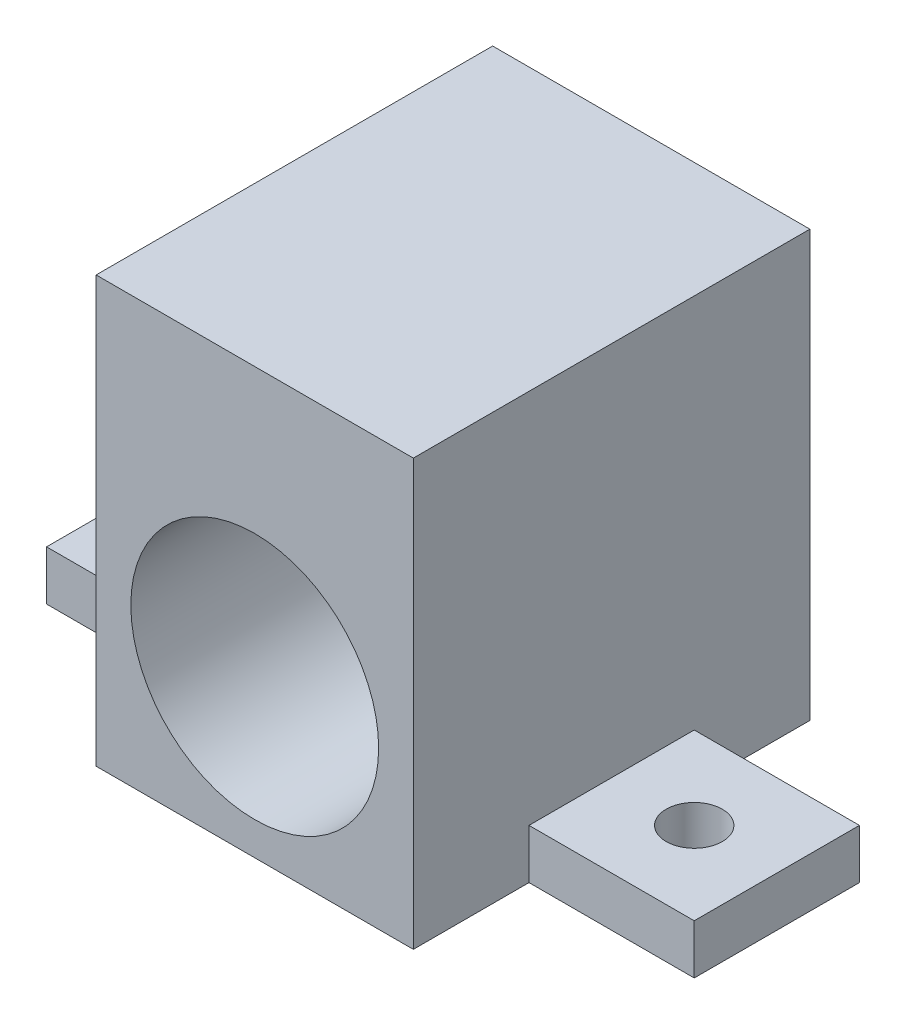
ISO-10303-21;
HEADER;
FILE_DESCRIPTION(('STEP AP214'),'2;1');
FILE_NAME('part.step','',(''),(''),'','','');
FILE_SCHEMA(('AUTOMOTIVE_DESIGN { 1 0 10303 214 1 1 1 1 }'));
ENDSEC;
DATA;
#1=APPLICATION_CONTEXT('core data for automotive mechanical design processes');
#2=APPLICATION_PROTOCOL_DEFINITION('international standard','automotive_design',2000,#1);
#3=PRODUCT_CONTEXT('',#1,'mechanical');
#4=PRODUCT('Part','Part','',(#3));
#5=PRODUCT_RELATED_PRODUCT_CATEGORY('part','',(#4));
#6=PRODUCT_DEFINITION_FORMATION('','',#4);
#7=PRODUCT_DEFINITION_CONTEXT('part definition',#1,'design');
#8=PRODUCT_DEFINITION('design','',#6,#7);
#9=PRODUCT_DEFINITION_SHAPE('','',#8);
#10=(LENGTH_UNIT() NAMED_UNIT(*) SI_UNIT(.MILLI.,.METRE.));
#11=(NAMED_UNIT(*) PLANE_ANGLE_UNIT() SI_UNIT($,.RADIAN.));
#12=(NAMED_UNIT(*) SI_UNIT($,.STERADIAN.) SOLID_ANGLE_UNIT());
#13=UNCERTAINTY_MEASURE_WITH_UNIT(LENGTH_MEASURE(1.E-05),#10,'distance_accuracy_value','');
#14=(GEOMETRIC_REPRESENTATION_CONTEXT(3) GLOBAL_UNCERTAINTY_ASSIGNED_CONTEXT((#13)) GLOBAL_UNIT_ASSIGNED_CONTEXT((#10,
#11,#12)) REPRESENTATION_CONTEXT('',''));
#15=CARTESIAN_POINT('',(0.,0.,0.));
#16=DIRECTION('',(0.,0.,1.));
#17=DIRECTION('',(1.,0.,0.));
#18=AXIS2_PLACEMENT_3D('',#15,#16,#17);
#19=CARTESIAN_POINT('',(0.,3.,0.));
#20=DIRECTION('',(0.,1.,0.));
#21=DIRECTION('',(0.,0.,1.));
#22=AXIS2_PLACEMENT_3D('',#19,#20,#21);
#23=PLANE('',#22);
#24=DIRECTION('',(0.,0.,-1.));
#25=VECTOR('',#24,1.);
#26=CARTESIAN_POINT('',(9.59999999999999,3.,-12.));
#27=LINE('',#26,#25);
#28=CARTESIAN_POINT('',(9.59999999999999,3.,5.));
#29=VERTEX_POINT('',#28);
#30=CARTESIAN_POINT('',(9.59999999999999,3.,-5.));
#31=VERTEX_POINT('',#30);
#32=EDGE_CURVE('E11',#29,#31,#27,.T.);
#33=ORIENTED_EDGE('',*,*,#32,.F.);
#34=DIRECTION('',(1.,0.,0.));
#35=VECTOR('',#34,1.);
#36=CARTESIAN_POINT('',(19.6,3.,5.));
#37=LINE('',#36,#35);
#38=CARTESIAN_POINT('',(19.6,3.,5.));
#39=VERTEX_POINT('',#38);
#40=EDGE_CURVE('E131',#29,#39,#37,.T.);
#41=ORIENTED_EDGE('',*,*,#40,.T.);
#42=DIRECTION('',(0.,0.,-1.));
#43=VECTOR('',#42,1.);
#44=CARTESIAN_POINT('',(19.6,3.,-5.));
#45=LINE('',#44,#43);
#46=CARTESIAN_POINT('',(19.6,3.,-5.));
#47=VERTEX_POINT('',#46);
#48=EDGE_CURVE('E124',#39,#47,#45,.T.);
#49=ORIENTED_EDGE('',*,*,#48,.T.);
#50=DIRECTION('',(-1.,0.,0.));
#51=VECTOR('',#50,1.);
#52=CARTESIAN_POINT('',(9.59999999999999,3.,-5.));
#53=LINE('',#52,#51);
#54=EDGE_CURVE('E128',#47,#31,#53,.T.);
#55=ORIENTED_EDGE('',*,*,#54,.T.);
#56=EDGE_LOOP('',(#33,#41,#49,#55));
#57=FACE_BOUND('',#56,.T.);
#58=CARTESIAN_POINT('',(14.6,3.,0.));
#59=DIRECTION('',(0.,1.,0.));
#60=DIRECTION('',(0.,0.,1.));
#61=AXIS2_PLACEMENT_3D('',#58,#59,#60);
#62=CIRCLE('',#61,1.7);
#63=CARTESIAN_POINT('',(14.6,3.,1.7));
#64=VERTEX_POINT('',#63);
#65=EDGE_CURVE('E254',#64,#64,#62,.T.);
#66=ORIENTED_EDGE('',*,*,#65,.F.);
#67=EDGE_LOOP('',(#66));
#68=FACE_BOUND('',#67,.T.);
#69=ADVANCED_FACE('F33',(#57,#68),#23,.T.);
#70=DIRECTION('',(0.,0.,1.));
#71=VECTOR('',#70,1.);
#72=CARTESIAN_POINT('',(-9.6,3.,-12.));
#73=LINE('',#72,#71);
#74=CARTESIAN_POINT('',(-9.60000000000001,3.,-5.));
#75=VERTEX_POINT('',#74);
#76=CARTESIAN_POINT('',(-9.60000000000001,3.,5.));
#77=VERTEX_POINT('',#76);
#78=EDGE_CURVE('E43',#75,#77,#73,.T.);
#79=ORIENTED_EDGE('',*,*,#78,.F.);
#80=DIRECTION('',(-1.,0.,0.));
#81=VECTOR('',#80,1.);
#82=CARTESIAN_POINT('',(-19.6,3.,-5.));
#83=LINE('',#82,#81);
#84=CARTESIAN_POINT('',(-19.6,3.,-5.));
#85=VERTEX_POINT('',#84);
#86=EDGE_CURVE('E170',#75,#85,#83,.T.);
#87=ORIENTED_EDGE('',*,*,#86,.T.);
#88=DIRECTION('',(0.,0.,1.));
#89=VECTOR('',#88,1.);
#90=CARTESIAN_POINT('',(-19.6,3.,5.));
#91=LINE('',#90,#89);
#92=CARTESIAN_POINT('',(-19.6,3.,5.));
#93=VERTEX_POINT('',#92);
#94=EDGE_CURVE('E109',#85,#93,#91,.T.);
#95=ORIENTED_EDGE('',*,*,#94,.T.);
#96=DIRECTION('',(1.,0.,0.));
#97=VECTOR('',#96,1.);
#98=CARTESIAN_POINT('',(-9.60000000000001,3.,5.));
#99=LINE('',#98,#97);
#100=EDGE_CURVE('E166',#93,#77,#99,.T.);
#101=ORIENTED_EDGE('',*,*,#100,.T.);
#102=EDGE_LOOP('',(#79,#87,#95,#101));
#103=FACE_BOUND('',#102,.T.);
#104=CARTESIAN_POINT('',(-14.6,3.,0.));
#105=DIRECTION('',(0.,1.,0.));
#106=DIRECTION('',(0.,0.,1.));
#107=AXIS2_PLACEMENT_3D('',#104,#105,#106);
#108=CIRCLE('',#107,1.7);
#109=CARTESIAN_POINT('',(-14.6,3.,1.7));
#110=VERTEX_POINT('',#109);
#111=EDGE_CURVE('E214',#110,#110,#108,.T.);
#112=ORIENTED_EDGE('',*,*,#111,.F.);
#113=EDGE_LOOP('',(#112));
#114=FACE_BOUND('',#113,.T.);
#115=ADVANCED_FACE('F247',(#103,#114),#23,.T.);
#116=CARTESIAN_POINT('',(0.,0.,0.));
#117=DIRECTION('',(0.,1.,0.));
#118=DIRECTION('',(0.,0.,1.));
#119=AXIS2_PLACEMENT_3D('',#116,#117,#118);
#120=PLANE('',#119);
#121=CARTESIAN_POINT('',(-14.6,0.,0.));
#122=DIRECTION('',(0.,1.,0.));
#123=DIRECTION('',(0.,0.,1.));
#124=AXIS2_PLACEMENT_3D('',#121,#122,#123);
#125=CIRCLE('',#124,1.7);
#126=CARTESIAN_POINT('',(-14.6,0.,1.7));
#127=VERTEX_POINT('',#126);
#128=EDGE_CURVE('E219',#127,#127,#125,.T.);
#129=ORIENTED_EDGE('',*,*,#128,.T.);
#130=EDGE_LOOP('',(#129));
#131=FACE_BOUND('',#130,.T.);
#132=DIRECTION('',(-1.,0.,0.));
#133=VECTOR('',#132,1.);
#134=CARTESIAN_POINT('',(-19.6,0.,-5.));
#135=LINE('',#134,#133);
#136=CARTESIAN_POINT('',(-9.60000000000001,0.,-5.));
#137=VERTEX_POINT('',#136);
#138=CARTESIAN_POINT('',(-19.6,0.,-5.));
#139=VERTEX_POINT('',#138);
#140=EDGE_CURVE('E211',#137,#139,#135,.T.);
#141=ORIENTED_EDGE('',*,*,#140,.F.);
#142=DIRECTION('',(0.,0.,1.));
#143=VECTOR('',#142,1.);
#144=CARTESIAN_POINT('',(-9.60000000000001,0.,-5.));
#145=LINE('',#144,#143);
#146=CARTESIAN_POINT('',(-9.60000000000001,0.,-12.));
#147=VERTEX_POINT('',#146);
#148=EDGE_CURVE('E100',#147,#137,#145,.T.);
#149=ORIENTED_EDGE('',*,*,#148,.F.);
#150=DIRECTION('',(-1.,0.,0.));
#151=VECTOR('',#150,1.);
#152=CARTESIAN_POINT('',(-9.60000000000001,0.,-12.));
#153=LINE('',#152,#151);
#154=CARTESIAN_POINT('',(9.59999999999999,0.,-12.));
#155=VERTEX_POINT('',#154);
#156=EDGE_CURVE('E94',#155,#147,#153,.T.);
#157=ORIENTED_EDGE('',*,*,#156,.F.);
#158=DIRECTION('',(0.,0.,-1.));
#159=VECTOR('',#158,1.);
#160=CARTESIAN_POINT('',(9.59999999999999,0.,-12.));
#161=LINE('',#160,#159);
#162=CARTESIAN_POINT('',(9.59999999999999,0.,-5.));
#163=VERTEX_POINT('',#162);
#164=EDGE_CURVE('E190',#163,#155,#161,.T.);
#165=ORIENTED_EDGE('',*,*,#164,.F.);
#166=DIRECTION('',(-1.,0.,0.));
#167=VECTOR('',#166,1.);
#168=CARTESIAN_POINT('',(9.59999999999999,0.,-5.));
#169=LINE('',#168,#167);
#170=CARTESIAN_POINT('',(19.6,0.,-5.));
#171=VERTEX_POINT('',#170);
#172=EDGE_CURVE('E232',#171,#163,#169,.T.);
#173=ORIENTED_EDGE('',*,*,#172,.F.);
#174=DIRECTION('',(0.,0.,-1.));
#175=VECTOR('',#174,1.);
#176=CARTESIAN_POINT('',(19.6,0.,-5.));
#177=LINE('',#176,#175);
#178=CARTESIAN_POINT('',(19.6,0.,5.));
#179=VERTEX_POINT('',#178);
#180=EDGE_CURVE('E140',#179,#171,#177,.T.);
#181=ORIENTED_EDGE('',*,*,#180,.F.);
#182=DIRECTION('',(1.,0.,0.));
#183=VECTOR('',#182,1.);
#184=CARTESIAN_POINT('',(19.6,0.,5.));
#185=LINE('',#184,#183);
#186=CARTESIAN_POINT('',(9.59999999999999,0.,5.));
#187=VERTEX_POINT('',#186);
#188=EDGE_CURVE('E229',#187,#179,#185,.T.);
#189=ORIENTED_EDGE('',*,*,#188,.F.);
#190=DIRECTION('',(0.,0.,-1.));
#191=VECTOR('',#190,1.);
#192=CARTESIAN_POINT('',(9.59999999999999,0.,5.));
#193=LINE('',#192,#191);
#194=CARTESIAN_POINT('',(9.59999999999999,0.,12.));
#195=VERTEX_POINT('',#194);
#196=EDGE_CURVE('E227',#195,#187,#193,.T.);
#197=ORIENTED_EDGE('',*,*,#196,.F.);
#198=DIRECTION('',(1.,0.,0.));
#199=VECTOR('',#198,1.);
#200=CARTESIAN_POINT('',(9.59999999999999,0.,12.));
#201=LINE('',#200,#199);
#202=CARTESIAN_POINT('',(-9.6,0.,12.));
#203=VERTEX_POINT('',#202);
#204=EDGE_CURVE('E225',#203,#195,#201,.T.);
#205=ORIENTED_EDGE('',*,*,#204,.F.);
#206=DIRECTION('',(0.,0.,1.));
#207=VECTOR('',#206,1.);
#208=CARTESIAN_POINT('',(-9.6,0.,12.));
#209=LINE('',#208,#207);
#210=CARTESIAN_POINT('',(-9.60000000000001,0.,5.));
#211=VERTEX_POINT('',#210);
#212=EDGE_CURVE('E223',#211,#203,#209,.T.);
#213=ORIENTED_EDGE('',*,*,#212,.F.);
#214=DIRECTION('',(1.,0.,0.));
#215=VECTOR('',#214,1.);
#216=CARTESIAN_POINT('',(-9.60000000000001,0.,5.));
#217=LINE('',#216,#215);
#218=CARTESIAN_POINT('',(-19.6,0.,5.));
#219=VERTEX_POINT('',#218);
#220=EDGE_CURVE('E216',#219,#211,#217,.T.);
#221=ORIENTED_EDGE('',*,*,#220,.F.);
#222=DIRECTION('',(0.,0.,1.));
#223=VECTOR('',#222,1.);
#224=CARTESIAN_POINT('',(-19.6,0.,5.));
#225=LINE('',#224,#223);
#226=EDGE_CURVE('E213',#139,#219,#225,.T.);
#227=ORIENTED_EDGE('',*,*,#226,.F.);
#228=EDGE_LOOP('',(#141,#149,#157,#165,#173,#181,#189,#197,#205,#213,#221,#227));
#229=FACE_BOUND('',#228,.T.);
#230=CARTESIAN_POINT('',(14.6,0.,0.));
#231=DIRECTION('',(0.,1.,0.));
#232=DIRECTION('',(0.,0.,1.));
#233=AXIS2_PLACEMENT_3D('',#230,#231,#232);
#234=CIRCLE('',#233,1.7);
#235=CARTESIAN_POINT('',(14.6,0.,1.7));
#236=VERTEX_POINT('',#235);
#237=EDGE_CURVE('E252',#236,#236,#234,.T.);
#238=ORIENTED_EDGE('',*,*,#237,.T.);
#239=EDGE_LOOP('',(#238));
#240=FACE_BOUND('',#239,.T.);
#241=ADVANCED_FACE('F244',(#131,#229,#240),#120,.F.);
#242=CARTESIAN_POINT('',(-19.6,3.,-5.));
#243=DIRECTION('',(0.,0.,1.));
#244=DIRECTION('',(1.,0.,0.));
#245=AXIS2_PLACEMENT_3D('',#242,#243,#244);
#246=PLANE('',#245);
#247=ORIENTED_EDGE('',*,*,#140,.T.);
#248=DIRECTION('',(0.,-1.,0.));
#249=VECTOR('',#248,1.);
#250=CARTESIAN_POINT('',(-19.6,3.,-5.));
#251=LINE('',#250,#249);
#252=EDGE_CURVE('E203',#85,#139,#251,.T.);
#253=ORIENTED_EDGE('',*,*,#252,.F.);
#254=ORIENTED_EDGE('',*,*,#86,.F.);
#255=DIRECTION('',(0.,-1.,0.));
#256=VECTOR('',#255,1.);
#257=CARTESIAN_POINT('',(-9.60000000000001,3.,-5.));
#258=LINE('',#257,#256);
#259=EDGE_CURVE('E148',#75,#137,#258,.T.);
#260=ORIENTED_EDGE('',*,*,#259,.T.);
#261=EDGE_LOOP('',(#247,#253,#254,#260));
#262=FACE_BOUND('',#261,.T.);
#263=ADVANCED_FACE('F35',(#262),#246,.F.);
#264=CARTESIAN_POINT('',(-19.6,3.,5.));
#265=DIRECTION('',(1.,0.,0.));
#266=DIRECTION('',(0.,0.,-1.));
#267=AXIS2_PLACEMENT_3D('',#264,#265,#266);
#268=PLANE('',#267);
#269=ORIENTED_EDGE('',*,*,#226,.T.);
#270=DIRECTION('',(0.,-1.,0.));
#271=VECTOR('',#270,1.);
#272=CARTESIAN_POINT('',(-19.6,3.,5.));
#273=LINE('',#272,#271);
#274=EDGE_CURVE('E180',#93,#219,#273,.T.);
#275=ORIENTED_EDGE('',*,*,#274,.F.);
#276=ORIENTED_EDGE('',*,*,#94,.F.);
#277=ORIENTED_EDGE('',*,*,#252,.T.);
#278=EDGE_LOOP('',(#269,#275,#276,#277));
#279=FACE_BOUND('',#278,.T.);
#280=ADVANCED_FACE('F304',(#279),#268,.F.);
#281=CARTESIAN_POINT('',(-9.60000000000001,3.,5.));
#282=DIRECTION('',(0.,0.,-1.));
#283=DIRECTION('',(-1.,0.,0.));
#284=AXIS2_PLACEMENT_3D('',#281,#282,#283);
#285=PLANE('',#284);
#286=ORIENTED_EDGE('',*,*,#220,.T.);
#287=DIRECTION('',(0.,-1.,0.));
#288=VECTOR('',#287,1.);
#289=CARTESIAN_POINT('',(-9.60000000000001,3.,5.));
#290=LINE('',#289,#288);
#291=EDGE_CURVE('E177',#77,#211,#290,.T.);
#292=ORIENTED_EDGE('',*,*,#291,.F.);
#293=ORIENTED_EDGE('',*,*,#100,.F.);
#294=ORIENTED_EDGE('',*,*,#274,.T.);
#295=EDGE_LOOP('',(#286,#292,#293,#294));
#296=FACE_BOUND('',#295,.T.);
#297=ADVANCED_FACE('F301',(#296),#285,.F.);
#298=CARTESIAN_POINT('',(9.59999999999999,3.,12.));
#299=DIRECTION('',(0.,0.,-1.));
#300=DIRECTION('',(-1.,0.,0.));
#301=AXIS2_PLACEMENT_3D('',#298,#299,#300);
#302=PLANE('',#301);
#303=CARTESIAN_POINT('',(0.,9.5,12.));
#304=DIRECTION('',(0.,0.,1.));
#305=DIRECTION('',(1.,0.,0.));
#306=AXIS2_PLACEMENT_3D('',#303,#304,#305);
#307=CIRCLE('',#306,7.5);
#308=CARTESIAN_POINT('',(7.5,9.5,12.));
#309=VERTEX_POINT('',#308);
#310=EDGE_CURVE('E327',#309,#309,#307,.T.);
#311=ORIENTED_EDGE('',*,*,#310,.F.);
#312=EDGE_LOOP('',(#311));
#313=FACE_BOUND('',#312,.T.);
#314=ORIENTED_EDGE('',*,*,#204,.T.);
#315=DIRECTION('',(0.,-1.,0.));
#316=VECTOR('',#315,1.);
#317=CARTESIAN_POINT('',(9.59999999999999,3.,12.));
#318=LINE('',#317,#316);
#319=CARTESIAN_POINT('',(9.59999999999999,25.752,12.));
#320=VERTEX_POINT('',#319);
#321=EDGE_CURVE('E164',#320,#195,#318,.T.);
#322=ORIENTED_EDGE('',*,*,#321,.F.);
#323=DIRECTION('',(1.,0.,0.));
#324=VECTOR('',#323,1.);
#325=CARTESIAN_POINT('',(9.59999999999999,25.752,12.));
#326=LINE('',#325,#324);
#327=CARTESIAN_POINT('',(-9.6,25.752,12.));
#328=VERTEX_POINT('',#327);
#329=EDGE_CURVE('E255',#328,#320,#326,.T.);
#330=ORIENTED_EDGE('',*,*,#329,.F.);
#331=DIRECTION('',(0.,-1.,0.));
#332=VECTOR('',#331,1.);
#333=CARTESIAN_POINT('',(-9.6,3.,12.));
#334=LINE('',#333,#332);
#335=EDGE_CURVE('E181',#328,#203,#334,.T.);
#336=ORIENTED_EDGE('',*,*,#335,.T.);
#337=EDGE_LOOP('',(#314,#322,#330,#336));
#338=FACE_BOUND('',#337,.T.);
#339=ADVANCED_FACE('F297',(#313,#338),#302,.F.);
#340=CARTESIAN_POINT('',(19.6,3.,5.));
#341=DIRECTION('',(0.,0.,-1.));
#342=DIRECTION('',(-1.,0.,0.));
#343=AXIS2_PLACEMENT_3D('',#340,#341,#342);
#344=PLANE('',#343);
#345=ORIENTED_EDGE('',*,*,#188,.T.);
#346=DIRECTION('',(0.,-1.,0.));
#347=VECTOR('',#346,1.);
#348=CARTESIAN_POINT('',(19.6,3.,5.));
#349=LINE('',#348,#347);
#350=EDGE_CURVE('E143',#39,#179,#349,.T.);
#351=ORIENTED_EDGE('',*,*,#350,.F.);
#352=ORIENTED_EDGE('',*,*,#40,.F.);
#353=DIRECTION('',(0.,-1.,0.));
#354=VECTOR('',#353,1.);
#355=CARTESIAN_POINT('',(9.59999999999999,3.,5.));
#356=LINE('',#355,#354);
#357=EDGE_CURVE('E161',#29,#187,#356,.T.);
#358=ORIENTED_EDGE('',*,*,#357,.T.);
#359=EDGE_LOOP('',(#345,#351,#352,#358));
#360=FACE_BOUND('',#359,.T.);
#361=ADVANCED_FACE('F294',(#360),#344,.F.);
#362=CARTESIAN_POINT('',(19.6,3.,-5.));
#363=DIRECTION('',(-1.,0.,0.));
#364=DIRECTION('',(0.,0.,1.));
#365=AXIS2_PLACEMENT_3D('',#362,#363,#364);
#366=PLANE('',#365);
#367=ORIENTED_EDGE('',*,*,#180,.T.);
#368=DIRECTION('',(0.,-1.,0.));
#369=VECTOR('',#368,1.);
#370=CARTESIAN_POINT('',(19.6,3.,-5.));
#371=LINE('',#370,#369);
#372=EDGE_CURVE('E137',#47,#171,#371,.T.);
#373=ORIENTED_EDGE('',*,*,#372,.F.);
#374=ORIENTED_EDGE('',*,*,#48,.F.);
#375=ORIENTED_EDGE('',*,*,#350,.T.);
#376=EDGE_LOOP('',(#367,#373,#374,#375));
#377=FACE_BOUND('',#376,.T.);
#378=ADVANCED_FACE('F138',(#377),#366,.F.);
#379=CARTESIAN_POINT('',(9.59999999999999,3.,-5.));
#380=DIRECTION('',(0.,0.,1.));
#381=DIRECTION('',(1.,0.,0.));
#382=AXIS2_PLACEMENT_3D('',#379,#380,#381);
#383=PLANE('',#382);
#384=ORIENTED_EDGE('',*,*,#172,.T.);
#385=DIRECTION('',(0.,-1.,0.));
#386=VECTOR('',#385,1.);
#387=CARTESIAN_POINT('',(9.59999999999999,3.,-5.));
#388=LINE('',#387,#386);
#389=EDGE_CURVE('E144',#31,#163,#388,.T.);
#390=ORIENTED_EDGE('',*,*,#389,.F.);
#391=ORIENTED_EDGE('',*,*,#54,.F.);
#392=ORIENTED_EDGE('',*,*,#372,.T.);
#393=EDGE_LOOP('',(#384,#390,#391,#392));
#394=FACE_BOUND('',#393,.T.);
#395=ADVANCED_FACE('F146',(#394),#383,.F.);
#396=CARTESIAN_POINT('',(9.59999999999999,3.,-12.));
#397=DIRECTION('',(-1.,0.,0.));
#398=DIRECTION('',(0.,0.,1.));
#399=AXIS2_PLACEMENT_3D('',#396,#397,#398);
#400=PLANE('',#399);
#401=ORIENTED_EDGE('',*,*,#164,.T.);
#402=DIRECTION('',(0.,-1.,0.));
#403=VECTOR('',#402,1.);
#404=CARTESIAN_POINT('',(9.59999999999999,3.,-12.));
#405=LINE('',#404,#403);
#406=CARTESIAN_POINT('',(9.59999999999999,25.752,-12.));
#407=VERTEX_POINT('',#406);
#408=EDGE_CURVE('E158',#407,#155,#405,.T.);
#409=ORIENTED_EDGE('',*,*,#408,.F.);
#410=DIRECTION('',(0.,0.,-1.));
#411=VECTOR('',#410,1.);
#412=CARTESIAN_POINT('',(9.59999999999999,25.752,-12.));
#413=LINE('',#412,#411);
#414=EDGE_CURVE('E322',#320,#407,#413,.T.);
#415=ORIENTED_EDGE('',*,*,#414,.F.);
#416=ORIENTED_EDGE('',*,*,#321,.T.);
#417=ORIENTED_EDGE('',*,*,#196,.T.);
#418=ORIENTED_EDGE('',*,*,#357,.F.);
#419=ORIENTED_EDGE('',*,*,#32,.T.);
#420=ORIENTED_EDGE('',*,*,#389,.T.);
#421=EDGE_LOOP('',(#401,#409,#415,#416,#417,#418,#419,#420));
#422=FACE_BOUND('',#421,.T.);
#423=ADVANCED_FACE('F236',(#422),#400,.F.);
#424=CARTESIAN_POINT('',(-9.60000000000001,3.,-12.));
#425=DIRECTION('',(0.,0.,1.));
#426=DIRECTION('',(1.,0.,0.));
#427=AXIS2_PLACEMENT_3D('',#424,#425,#426);
#428=PLANE('',#427);
#429=CARTESIAN_POINT('',(0.,9.5,-12.));
#430=DIRECTION('',(0.,0.,1.));
#431=DIRECTION('',(1.,0.,0.));
#432=AXIS2_PLACEMENT_3D('',#429,#430,#431);
#433=CIRCLE('',#432,7.5);
#434=CARTESIAN_POINT('',(7.5,9.5,-12.));
#435=VERTEX_POINT('',#434);
#436=EDGE_CURVE('E323',#435,#435,#433,.T.);
#437=ORIENTED_EDGE('',*,*,#436,.T.);
#438=EDGE_LOOP('',(#437));
#439=FACE_BOUND('',#438,.T.);
#440=ORIENTED_EDGE('',*,*,#156,.T.);
#441=DIRECTION('',(0.,-1.,0.));
#442=VECTOR('',#441,1.);
#443=CARTESIAN_POINT('',(-9.60000000000001,3.,-12.));
#444=LINE('',#443,#442);
#445=CARTESIAN_POINT('',(-9.6,25.752,-12.));
#446=VERTEX_POINT('',#445);
#447=EDGE_CURVE('E150',#446,#147,#444,.T.);
#448=ORIENTED_EDGE('',*,*,#447,.F.);
#449=DIRECTION('',(-1.,0.,0.));
#450=VECTOR('',#449,1.);
#451=CARTESIAN_POINT('',(9.59999999999999,25.752,-12.));
#452=LINE('',#451,#450);
#453=EDGE_CURVE('E242',#407,#446,#452,.T.);
#454=ORIENTED_EDGE('',*,*,#453,.F.);
#455=ORIENTED_EDGE('',*,*,#408,.T.);
#456=EDGE_LOOP('',(#440,#448,#454,#455));
#457=FACE_BOUND('',#456,.T.);
#458=ADVANCED_FACE('F240',(#439,#457),#428,.F.);
#459=CARTESIAN_POINT('',(-9.60000000000001,3.,-5.));
#460=DIRECTION('',(1.,0.,0.));
#461=DIRECTION('',(0.,0.,-1.));
#462=AXIS2_PLACEMENT_3D('',#459,#460,#461);
#463=PLANE('',#462);
#464=ORIENTED_EDGE('',*,*,#148,.T.);
#465=ORIENTED_EDGE('',*,*,#259,.F.);
#466=ORIENTED_EDGE('',*,*,#78,.T.);
#467=ORIENTED_EDGE('',*,*,#291,.T.);
#468=ORIENTED_EDGE('',*,*,#212,.T.);
#469=ORIENTED_EDGE('',*,*,#335,.F.);
#470=DIRECTION('',(0.,0.,1.));
#471=VECTOR('',#470,1.);
#472=CARTESIAN_POINT('',(-9.6,25.752,-12.));
#473=LINE('',#472,#471);
#474=EDGE_CURVE('E260',#446,#328,#473,.T.);
#475=ORIENTED_EDGE('',*,*,#474,.F.);
#476=ORIENTED_EDGE('',*,*,#447,.T.);
#477=EDGE_LOOP('',(#464,#465,#466,#467,#468,#469,#475,#476));
#478=FACE_BOUND('',#477,.T.);
#479=ADVANCED_FACE('F207',(#478),#463,.F.);
#480=CARTESIAN_POINT('',(-14.6,3.,0.));
#481=DIRECTION('',(0.,-1.,0.));
#482=DIRECTION('',(0.,0.,-1.));
#483=AXIS2_PLACEMENT_3D('',#480,#481,#482);
#484=CYLINDRICAL_SURFACE('',#483,1.7);
#485=ORIENTED_EDGE('',*,*,#111,.T.);
#486=EDGE_LOOP('',(#485));
#487=FACE_BOUND('',#486,.T.);
#488=ORIENTED_EDGE('',*,*,#128,.F.);
#489=EDGE_LOOP('',(#488));
#490=FACE_BOUND('',#489,.T.);
#491=ADVANCED_FACE('F266',(#487,#490),#484,.F.);
#492=CARTESIAN_POINT('',(14.6,3.,0.));
#493=DIRECTION('',(0.,-1.,0.));
#494=DIRECTION('',(0.,0.,-1.));
#495=AXIS2_PLACEMENT_3D('',#492,#493,#494);
#496=CYLINDRICAL_SURFACE('',#495,1.7);
#497=ORIENTED_EDGE('',*,*,#65,.T.);
#498=EDGE_LOOP('',(#497));
#499=FACE_BOUND('',#498,.T.);
#500=ORIENTED_EDGE('',*,*,#237,.F.);
#501=EDGE_LOOP('',(#500));
#502=FACE_BOUND('',#501,.T.);
#503=ADVANCED_FACE('F268',(#499,#502),#496,.F.);
#504=CARTESIAN_POINT('',(0.,25.752,0.));
#505=DIRECTION('',(0.,-1.,0.));
#506=DIRECTION('',(0.,0.,-1.));
#507=AXIS2_PLACEMENT_3D('',#504,#505,#506);
#508=PLANE('',#507);
#509=ORIENTED_EDGE('',*,*,#414,.T.);
#510=ORIENTED_EDGE('',*,*,#453,.T.);
#511=ORIENTED_EDGE('',*,*,#474,.T.);
#512=ORIENTED_EDGE('',*,*,#329,.T.);
#513=EDGE_LOOP('',(#509,#510,#511,#512));
#514=FACE_BOUND('',#513,.T.);
#515=ADVANCED_FACE('F275',(#514),#508,.F.);
#516=CARTESIAN_POINT('',(0.,9.5,-12.));
#517=DIRECTION('',(0.,0.,1.));
#518=DIRECTION('',(1.,0.,0.));
#519=AXIS2_PLACEMENT_3D('',#516,#517,#518);
#520=CYLINDRICAL_SURFACE('',#519,7.5);
#521=ORIENTED_EDGE('',*,*,#436,.F.);
#522=EDGE_LOOP('',(#521));
#523=FACE_BOUND('',#522,.T.);
#524=ORIENTED_EDGE('',*,*,#310,.T.);
#525=EDGE_LOOP('',(#524));
#526=FACE_BOUND('',#525,.T.);
#527=ADVANCED_FACE('F334',(#523,#526),#520,.F.);
#528=CLOSED_SHELL('',(#69,#115,#241,#263,#280,#297,#339,#361,#378,#395,#423,#458,#479,#491,#503,
#515,#527));
#529=MANIFOLD_SOLID_BREP('B2',#528);
#530=ADVANCED_BREP_SHAPE_REPRESENTATION('',(#18,#529),#14);
#531=SHAPE_DEFINITION_REPRESENTATION(#9,#530);
ENDSEC;
END-ISO-10303-21;
